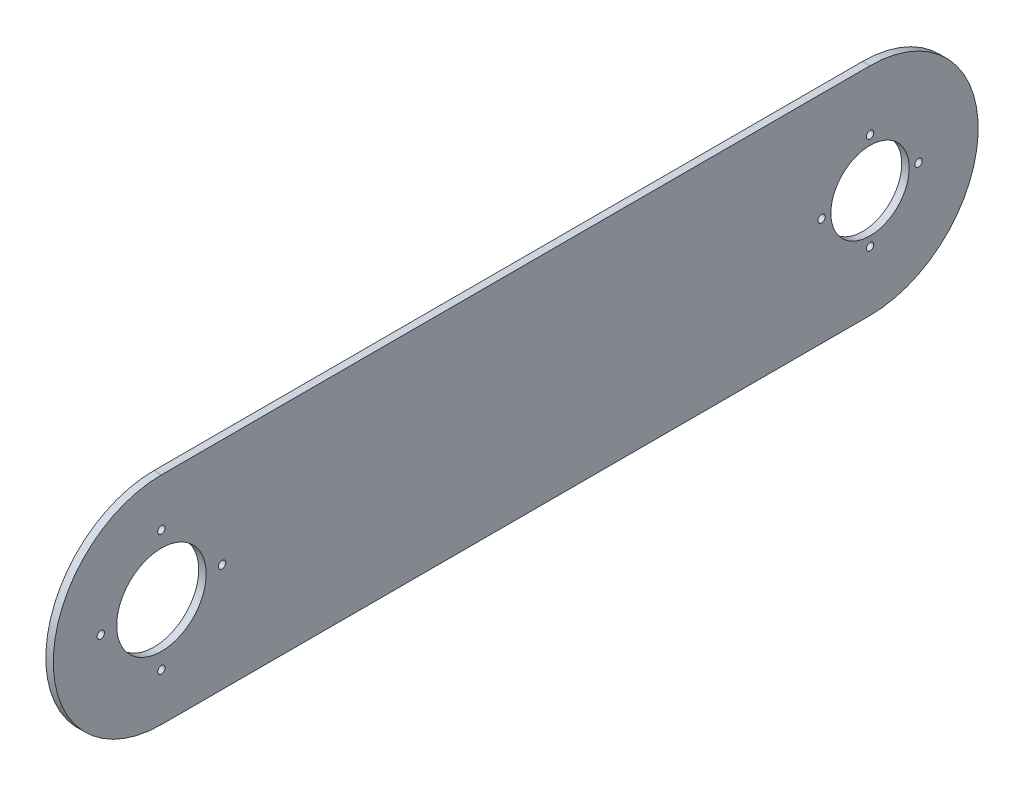
ISO-10303-21;
HEADER;
FILE_DESCRIPTION(('STEP AP214'),'2;1');
FILE_NAME('part.step','',(''),(''),'','','');
FILE_SCHEMA(('AUTOMOTIVE_DESIGN { 1 0 10303 214 1 1 1 1 }'));
ENDSEC;
DATA;
#1=APPLICATION_CONTEXT('core data for automotive mechanical design processes');
#2=APPLICATION_PROTOCOL_DEFINITION('international standard','automotive_design',2000,#1);
#3=PRODUCT_CONTEXT('',#1,'mechanical');
#4=PRODUCT('Part','Part','',(#3));
#5=PRODUCT_RELATED_PRODUCT_CATEGORY('part','',(#4));
#6=PRODUCT_DEFINITION_FORMATION('','',#4);
#7=PRODUCT_DEFINITION_CONTEXT('part definition',#1,'design');
#8=PRODUCT_DEFINITION('design','',#6,#7);
#9=PRODUCT_DEFINITION_SHAPE('','',#8);
#10=(LENGTH_UNIT() NAMED_UNIT(*) SI_UNIT(.MILLI.,.METRE.));
#11=(NAMED_UNIT(*) PLANE_ANGLE_UNIT() SI_UNIT($,.RADIAN.));
#12=(NAMED_UNIT(*) SI_UNIT($,.STERADIAN.) SOLID_ANGLE_UNIT());
#13=UNCERTAINTY_MEASURE_WITH_UNIT(LENGTH_MEASURE(1.E-05),#10,'distance_accuracy_value','');
#14=(GEOMETRIC_REPRESENTATION_CONTEXT(3) GLOBAL_UNCERTAINTY_ASSIGNED_CONTEXT((#13)) GLOBAL_UNIT_ASSIGNED_CONTEXT((#10,
#11,#12)) REPRESENTATION_CONTEXT('',''));
#15=CARTESIAN_POINT('',(0.,0.,0.));
#16=DIRECTION('',(0.,0.,1.));
#17=DIRECTION('',(1.,0.,0.));
#18=AXIS2_PLACEMENT_3D('',#15,#16,#17);
#19=CARTESIAN_POINT('',(4.,0.,0.));
#20=DIRECTION('',(1.,0.,0.));
#21=DIRECTION('',(0.,0.,-1.));
#22=AXIS2_PLACEMENT_3D('',#19,#20,#21);
#23=PLANE('',#22);
#24=CARTESIAN_POINT('',(4.,26.,-380.));
#25=DIRECTION('',(-1.,0.,0.));
#26=DIRECTION('',(0.,0.,1.));
#27=AXIS2_PLACEMENT_3D('',#24,#25,#26);
#28=CIRCLE('',#27,2.);
#29=CARTESIAN_POINT('',(4.,26.,-378.));
#30=VERTEX_POINT('',#29);
#31=EDGE_CURVE('E157',#30,#30,#28,.T.);
#32=ORIENTED_EDGE('',*,*,#31,.T.);
#33=EDGE_LOOP('',(#32));
#34=FACE_BOUND('',#33,.T.);
#35=CARTESIAN_POINT('',(4.,2.77555756156289E-13,-354.));
#36=DIRECTION('',(-1.,0.,0.));
#37=DIRECTION('',(0.,0.,1.));
#38=AXIS2_PLACEMENT_3D('',#35,#36,#37);
#39=CIRCLE('',#38,2.);
#40=CARTESIAN_POINT('',(4.,2.77555756156289E-13,-352.));
#41=VERTEX_POINT('',#40);
#42=EDGE_CURVE('E170',#41,#41,#39,.T.);
#43=ORIENTED_EDGE('',*,*,#42,.T.);
#44=EDGE_LOOP('',(#43));
#45=FACE_BOUND('',#44,.T.);
#46=CARTESIAN_POINT('',(4.,-26.,-379.999999999999));
#47=DIRECTION('',(-1.,0.,0.));
#48=DIRECTION('',(0.,0.,1.));
#49=AXIS2_PLACEMENT_3D('',#46,#47,#48);
#50=CIRCLE('',#49,1.99999999999999);
#51=CARTESIAN_POINT('',(4.,-26.,-377.999999999999));
#52=VERTEX_POINT('',#51);
#53=EDGE_CURVE('E164',#52,#52,#50,.T.);
#54=ORIENTED_EDGE('',*,*,#53,.T.);
#55=EDGE_LOOP('',(#54));
#56=FACE_BOUND('',#55,.T.);
#57=CARTESIAN_POINT('',(4.,-1.11022302462516E-13,-406.));
#58=DIRECTION('',(-1.,0.,0.));
#59=DIRECTION('',(0.,0.,1.));
#60=AXIS2_PLACEMENT_3D('',#57,#58,#59);
#61=CIRCLE('',#60,2.);
#62=CARTESIAN_POINT('',(4.,-1.11022302462516E-13,-404.));
#63=VERTEX_POINT('',#62);
#64=EDGE_CURVE('E158',#63,#63,#61,.T.);
#65=ORIENTED_EDGE('',*,*,#64,.T.);
#66=EDGE_LOOP('',(#65));
#67=FACE_BOUND('',#66,.T.);
#68=CARTESIAN_POINT('',(4.,32.5,0.));
#69=DIRECTION('',(-1.,0.,0.));
#70=DIRECTION('',(0.,0.,1.));
#71=AXIS2_PLACEMENT_3D('',#68,#69,#70);
#72=CIRCLE('',#71,2.);
#73=CARTESIAN_POINT('',(4.,32.5,2.));
#74=VERTEX_POINT('',#73);
#75=EDGE_CURVE('E125',#74,#74,#72,.T.);
#76=ORIENTED_EDGE('',*,*,#75,.T.);
#77=EDGE_LOOP('',(#76));
#78=FACE_BOUND('',#77,.T.);
#79=CARTESIAN_POINT('',(4.,0.,32.5));
#80=DIRECTION('',(-1.,0.,0.));
#81=DIRECTION('',(0.,0.,1.));
#82=AXIS2_PLACEMENT_3D('',#79,#80,#81);
#83=CIRCLE('',#82,2.);
#84=CARTESIAN_POINT('',(4.,0.,34.5));
#85=VERTEX_POINT('',#84);
#86=EDGE_CURVE('E141',#85,#85,#83,.T.);
#87=ORIENTED_EDGE('',*,*,#86,.T.);
#88=EDGE_LOOP('',(#87));
#89=FACE_BOUND('',#88,.T.);
#90=CARTESIAN_POINT('',(4.,-32.5,0.));
#91=DIRECTION('',(-1.,0.,0.));
#92=DIRECTION('',(0.,0.,1.));
#93=AXIS2_PLACEMENT_3D('',#90,#91,#92);
#94=CIRCLE('',#93,2.);
#95=CARTESIAN_POINT('',(4.,-32.5,2.));
#96=VERTEX_POINT('',#95);
#97=EDGE_CURVE('E135',#96,#96,#94,.T.);
#98=ORIENTED_EDGE('',*,*,#97,.T.);
#99=EDGE_LOOP('',(#98));
#100=FACE_BOUND('',#99,.T.);
#101=CARTESIAN_POINT('',(4.,0.,-32.5));
#102=DIRECTION('',(-1.,0.,0.));
#103=DIRECTION('',(0.,0.,1.));
#104=AXIS2_PLACEMENT_3D('',#101,#102,#103);
#105=CIRCLE('',#104,2.);
#106=CARTESIAN_POINT('',(4.,0.,-30.5));
#107=VERTEX_POINT('',#106);
#108=EDGE_CURVE('E128',#107,#107,#105,.T.);
#109=ORIENTED_EDGE('',*,*,#108,.T.);
#110=EDGE_LOOP('',(#109));
#111=FACE_BOUND('',#110,.T.);
#112=CARTESIAN_POINT('',(4.,0.,0.));
#113=DIRECTION('',(1.,0.,0.));
#114=DIRECTION('',(0.,0.,-1.));
#115=AXIS2_PLACEMENT_3D('',#112,#113,#114);
#116=CIRCLE('',#115,24.);
#117=CARTESIAN_POINT('',(4.,0.,-24.));
#118=VERTEX_POINT('',#117);
#119=EDGE_CURVE('E110',#118,#118,#116,.T.);
#120=ORIENTED_EDGE('',*,*,#119,.F.);
#121=EDGE_LOOP('',(#120));
#122=FACE_BOUND('',#121,.T.);
#123=CARTESIAN_POINT('',(4.,0.,0.));
#124=DIRECTION('',(1.,0.,0.));
#125=DIRECTION('',(0.,0.,-1.));
#126=AXIS2_PLACEMENT_3D('',#123,#124,#125);
#127=CIRCLE('',#126,58.);
#128=CARTESIAN_POINT('',(4.,58.,0.));
#129=VERTEX_POINT('',#128);
#130=CARTESIAN_POINT('',(4.,-58.,0.));
#131=VERTEX_POINT('',#130);
#132=EDGE_CURVE('E95',#129,#131,#127,.T.);
#133=ORIENTED_EDGE('',*,*,#132,.T.);
#134=DIRECTION('',(0.,0.,-1.));
#135=VECTOR('',#134,1.);
#136=CARTESIAN_POINT('',(4.,-58.,0.));
#137=LINE('',#136,#135);
#138=CARTESIAN_POINT('',(4.,-58.,-380.));
#139=VERTEX_POINT('',#138);
#140=EDGE_CURVE('E90',#131,#139,#137,.T.);
#141=ORIENTED_EDGE('',*,*,#140,.T.);
#142=CARTESIAN_POINT('',(4.,0.,-380.));
#143=DIRECTION('',(1.,0.,0.));
#144=DIRECTION('',(0.,0.,-1.));
#145=AXIS2_PLACEMENT_3D('',#142,#143,#144);
#146=CIRCLE('',#145,58.);
#147=CARTESIAN_POINT('',(4.,58.,-380.));
#148=VERTEX_POINT('',#147);
#149=EDGE_CURVE('E93',#139,#148,#146,.T.);
#150=ORIENTED_EDGE('',*,*,#149,.T.);
#151=DIRECTION('',(0.,0.,1.));
#152=VECTOR('',#151,1.);
#153=CARTESIAN_POINT('',(4.,58.,0.));
#154=LINE('',#153,#152);
#155=EDGE_CURVE('E60',#148,#129,#154,.T.);
#156=ORIENTED_EDGE('',*,*,#155,.T.);
#157=EDGE_LOOP('',(#133,#141,#150,#156));
#158=FACE_BOUND('',#157,.T.);
#159=CARTESIAN_POINT('',(4.,0.,-380.));
#160=DIRECTION('',(1.,0.,0.));
#161=DIRECTION('',(0.,0.,-1.));
#162=AXIS2_PLACEMENT_3D('',#159,#160,#161);
#163=CIRCLE('',#162,21.);
#164=CARTESIAN_POINT('',(4.,0.,-401.));
#165=VERTEX_POINT('',#164);
#166=EDGE_CURVE('E132',#165,#165,#163,.F.);
#167=ORIENTED_EDGE('',*,*,#166,.T.);
#168=EDGE_LOOP('',(#167));
#169=FACE_BOUND('',#168,.T.);
#170=ADVANCED_FACE('F43',(#34,#45,#56,#67,#78,#89,#100,#111,#122,#158,#169),#23,.T.);
#171=CARTESIAN_POINT('',(0.,0.,0.));
#172=DIRECTION('',(1.,0.,0.));
#173=DIRECTION('',(0.,0.,-1.));
#174=AXIS2_PLACEMENT_3D('',#171,#172,#173);
#175=PLANE('',#174);
#176=CARTESIAN_POINT('',(0.,26.,-380.));
#177=DIRECTION('',(-1.,0.,0.));
#178=DIRECTION('',(0.,0.,1.));
#179=AXIS2_PLACEMENT_3D('',#176,#177,#178);
#180=CIRCLE('',#179,2.);
#181=CARTESIAN_POINT('',(0.,26.,-378.));
#182=VERTEX_POINT('',#181);
#183=EDGE_CURVE('E176',#182,#182,#180,.T.);
#184=ORIENTED_EDGE('',*,*,#183,.F.);
#185=EDGE_LOOP('',(#184));
#186=FACE_BOUND('',#185,.T.);
#187=CARTESIAN_POINT('',(0.,2.77555756156289E-13,-354.));
#188=DIRECTION('',(-1.,0.,0.));
#189=DIRECTION('',(0.,0.,1.));
#190=AXIS2_PLACEMENT_3D('',#187,#188,#189);
#191=CIRCLE('',#190,2.);
#192=CARTESIAN_POINT('',(0.,2.77555756156289E-13,-352.));
#193=VERTEX_POINT('',#192);
#194=EDGE_CURVE('E173',#193,#193,#191,.T.);
#195=ORIENTED_EDGE('',*,*,#194,.F.);
#196=EDGE_LOOP('',(#195));
#197=FACE_BOUND('',#196,.T.);
#198=CARTESIAN_POINT('',(0.,-26.,-379.999999999999));
#199=DIRECTION('',(-1.,0.,0.));
#200=DIRECTION('',(0.,0.,1.));
#201=AXIS2_PLACEMENT_3D('',#198,#199,#200);
#202=CIRCLE('',#201,1.99999999999999);
#203=CARTESIAN_POINT('',(0.,-26.,-377.999999999999));
#204=VERTEX_POINT('',#203);
#205=EDGE_CURVE('E167',#204,#204,#202,.T.);
#206=ORIENTED_EDGE('',*,*,#205,.F.);
#207=EDGE_LOOP('',(#206));
#208=FACE_BOUND('',#207,.T.);
#209=CARTESIAN_POINT('',(0.,-1.11022302462516E-13,-406.));
#210=DIRECTION('',(-1.,0.,0.));
#211=DIRECTION('',(0.,0.,1.));
#212=AXIS2_PLACEMENT_3D('',#209,#210,#211);
#213=CIRCLE('',#212,2.);
#214=CARTESIAN_POINT('',(0.,-1.11022302462516E-13,-404.));
#215=VERTEX_POINT('',#214);
#216=EDGE_CURVE('E161',#215,#215,#213,.T.);
#217=ORIENTED_EDGE('',*,*,#216,.F.);
#218=EDGE_LOOP('',(#217));
#219=FACE_BOUND('',#218,.T.);
#220=CARTESIAN_POINT('',(0.,32.5,0.));
#221=DIRECTION('',(-1.,0.,0.));
#222=DIRECTION('',(0.,0.,1.));
#223=AXIS2_PLACEMENT_3D('',#220,#221,#222);
#224=CIRCLE('',#223,2.);
#225=CARTESIAN_POINT('',(0.,32.5,2.));
#226=VERTEX_POINT('',#225);
#227=EDGE_CURVE('E147',#226,#226,#224,.T.);
#228=ORIENTED_EDGE('',*,*,#227,.F.);
#229=EDGE_LOOP('',(#228));
#230=FACE_BOUND('',#229,.T.);
#231=CARTESIAN_POINT('',(0.,0.,32.5));
#232=DIRECTION('',(-1.,0.,0.));
#233=DIRECTION('',(0.,0.,1.));
#234=AXIS2_PLACEMENT_3D('',#231,#232,#233);
#235=CIRCLE('',#234,2.);
#236=CARTESIAN_POINT('',(0.,0.,34.5));
#237=VERTEX_POINT('',#236);
#238=EDGE_CURVE('E144',#237,#237,#235,.T.);
#239=ORIENTED_EDGE('',*,*,#238,.F.);
#240=EDGE_LOOP('',(#239));
#241=FACE_BOUND('',#240,.T.);
#242=CARTESIAN_POINT('',(0.,-32.5,0.));
#243=DIRECTION('',(-1.,0.,0.));
#244=DIRECTION('',(0.,0.,1.));
#245=AXIS2_PLACEMENT_3D('',#242,#243,#244);
#246=CIRCLE('',#245,2.);
#247=CARTESIAN_POINT('',(0.,-32.5,2.));
#248=VERTEX_POINT('',#247);
#249=EDGE_CURVE('E138',#248,#248,#246,.T.);
#250=ORIENTED_EDGE('',*,*,#249,.F.);
#251=EDGE_LOOP('',(#250));
#252=FACE_BOUND('',#251,.T.);
#253=CARTESIAN_POINT('',(0.,0.,-32.5));
#254=DIRECTION('',(-1.,0.,0.));
#255=DIRECTION('',(0.,0.,1.));
#256=AXIS2_PLACEMENT_3D('',#253,#254,#255);
#257=CIRCLE('',#256,2.);
#258=CARTESIAN_POINT('',(0.,0.,-30.5));
#259=VERTEX_POINT('',#258);
#260=EDGE_CURVE('E131',#259,#259,#257,.T.);
#261=ORIENTED_EDGE('',*,*,#260,.F.);
#262=EDGE_LOOP('',(#261));
#263=FACE_BOUND('',#262,.T.);
#264=CARTESIAN_POINT('',(0.,0.,0.));
#265=DIRECTION('',(1.,0.,0.));
#266=DIRECTION('',(0.,0.,-1.));
#267=AXIS2_PLACEMENT_3D('',#264,#265,#266);
#268=CIRCLE('',#267,58.);
#269=CARTESIAN_POINT('',(0.,58.,0.));
#270=VERTEX_POINT('',#269);
#271=CARTESIAN_POINT('',(0.,-58.,0.));
#272=VERTEX_POINT('',#271);
#273=EDGE_CURVE('E107',#270,#272,#268,.T.);
#274=ORIENTED_EDGE('',*,*,#273,.F.);
#275=DIRECTION('',(0.,0.,1.));
#276=VECTOR('',#275,1.);
#277=CARTESIAN_POINT('',(0.,58.,0.));
#278=LINE('',#277,#276);
#279=CARTESIAN_POINT('',(0.,58.,-380.));
#280=VERTEX_POINT('',#279);
#281=EDGE_CURVE('E83',#280,#270,#278,.T.);
#282=ORIENTED_EDGE('',*,*,#281,.F.);
#283=CARTESIAN_POINT('',(0.,0.,-380.));
#284=DIRECTION('',(1.,0.,0.));
#285=DIRECTION('',(0.,0.,-1.));
#286=AXIS2_PLACEMENT_3D('',#283,#284,#285);
#287=CIRCLE('',#286,58.);
#288=CARTESIAN_POINT('',(0.,-58.,-380.));
#289=VERTEX_POINT('',#288);
#290=EDGE_CURVE('E77',#289,#280,#287,.T.);
#291=ORIENTED_EDGE('',*,*,#290,.F.);
#292=DIRECTION('',(0.,0.,-1.));
#293=VECTOR('',#292,1.);
#294=CARTESIAN_POINT('',(0.,-58.,0.));
#295=LINE('',#294,#293);
#296=EDGE_CURVE('E99',#272,#289,#295,.T.);
#297=ORIENTED_EDGE('',*,*,#296,.F.);
#298=EDGE_LOOP('',(#274,#282,#291,#297));
#299=FACE_BOUND('',#298,.T.);
#300=CARTESIAN_POINT('',(0.,0.,0.));
#301=DIRECTION('',(1.,0.,0.));
#302=DIRECTION('',(0.,0.,-1.));
#303=AXIS2_PLACEMENT_3D('',#300,#301,#302);
#304=CIRCLE('',#303,24.);
#305=CARTESIAN_POINT('',(0.,0.,-24.));
#306=VERTEX_POINT('',#305);
#307=EDGE_CURVE('E122',#306,#306,#304,.T.);
#308=ORIENTED_EDGE('',*,*,#307,.T.);
#309=EDGE_LOOP('',(#308));
#310=FACE_BOUND('',#309,.T.);
#311=CARTESIAN_POINT('',(0.,0.,-380.));
#312=DIRECTION('',(-1.,0.,0.));
#313=DIRECTION('',(0.,0.,1.));
#314=AXIS2_PLACEMENT_3D('',#311,#312,#313);
#315=CIRCLE('',#314,21.);
#316=CARTESIAN_POINT('',(0.,0.,-359.));
#317=VERTEX_POINT('',#316);
#318=EDGE_CURVE('E154',#317,#317,#315,.T.);
#319=ORIENTED_EDGE('',*,*,#318,.F.);
#320=EDGE_LOOP('',(#319));
#321=FACE_BOUND('',#320,.T.);
#322=ADVANCED_FACE('F118',(#186,#197,#208,#219,#230,#241,#252,#263,#299,#310,#321),#175,.F.);
#323=CARTESIAN_POINT('',(4.,0.,0.));
#324=DIRECTION('',(-1.,0.,0.));
#325=DIRECTION('',(0.,0.,1.));
#326=AXIS2_PLACEMENT_3D('',#323,#324,#325);
#327=CYLINDRICAL_SURFACE('',#326,58.);
#328=ORIENTED_EDGE('',*,*,#273,.T.);
#329=DIRECTION('',(-1.,0.,0.));
#330=VECTOR('',#329,1.);
#331=CARTESIAN_POINT('',(4.,-58.,0.));
#332=LINE('',#331,#330);
#333=EDGE_CURVE('E11',#131,#272,#332,.T.);
#334=ORIENTED_EDGE('',*,*,#333,.F.);
#335=ORIENTED_EDGE('',*,*,#132,.F.);
#336=DIRECTION('',(-1.,0.,0.));
#337=VECTOR('',#336,1.);
#338=CARTESIAN_POINT('',(4.,58.,0.));
#339=LINE('',#338,#337);
#340=EDGE_CURVE('E103',#129,#270,#339,.T.);
#341=ORIENTED_EDGE('',*,*,#340,.T.);
#342=EDGE_LOOP('',(#328,#334,#335,#341));
#343=FACE_BOUND('',#342,.T.);
#344=ADVANCED_FACE('F45',(#343),#327,.T.);
#345=CARTESIAN_POINT('',(4.,-58.,0.));
#346=DIRECTION('',(0.,1.,0.));
#347=DIRECTION('',(0.,0.,1.));
#348=AXIS2_PLACEMENT_3D('',#345,#346,#347);
#349=PLANE('',#348);
#350=ORIENTED_EDGE('',*,*,#296,.T.);
#351=DIRECTION('',(-1.,0.,0.));
#352=VECTOR('',#351,1.);
#353=CARTESIAN_POINT('',(4.,-58.,-380.));
#354=LINE('',#353,#352);
#355=EDGE_CURVE('E52',#139,#289,#354,.T.);
#356=ORIENTED_EDGE('',*,*,#355,.F.);
#357=ORIENTED_EDGE('',*,*,#140,.F.);
#358=ORIENTED_EDGE('',*,*,#333,.T.);
#359=EDGE_LOOP('',(#350,#356,#357,#358));
#360=FACE_BOUND('',#359,.T.);
#361=ADVANCED_FACE('F98',(#360),#349,.F.);
#362=CARTESIAN_POINT('',(4.,0.,-380.));
#363=DIRECTION('',(-1.,0.,0.));
#364=DIRECTION('',(0.,0.,1.));
#365=AXIS2_PLACEMENT_3D('',#362,#363,#364);
#366=CYLINDRICAL_SURFACE('',#365,58.);
#367=ORIENTED_EDGE('',*,*,#290,.T.);
#368=DIRECTION('',(-1.,0.,0.));
#369=VECTOR('',#368,1.);
#370=CARTESIAN_POINT('',(4.,58.,-380.));
#371=LINE('',#370,#369);
#372=EDGE_CURVE('E100',#148,#280,#371,.T.);
#373=ORIENTED_EDGE('',*,*,#372,.F.);
#374=ORIENTED_EDGE('',*,*,#149,.F.);
#375=ORIENTED_EDGE('',*,*,#355,.T.);
#376=EDGE_LOOP('',(#367,#373,#374,#375));
#377=FACE_BOUND('',#376,.T.);
#378=ADVANCED_FACE('F101',(#377),#366,.T.);
#379=CARTESIAN_POINT('',(4.,58.,0.));
#380=DIRECTION('',(0.,-1.,0.));
#381=DIRECTION('',(0.,0.,-1.));
#382=AXIS2_PLACEMENT_3D('',#379,#380,#381);
#383=PLANE('',#382);
#384=ORIENTED_EDGE('',*,*,#281,.T.);
#385=ORIENTED_EDGE('',*,*,#340,.F.);
#386=ORIENTED_EDGE('',*,*,#155,.F.);
#387=ORIENTED_EDGE('',*,*,#372,.T.);
#388=EDGE_LOOP('',(#384,#385,#386,#387));
#389=FACE_BOUND('',#388,.T.);
#390=ADVANCED_FACE('F115',(#389),#383,.F.);
#391=CARTESIAN_POINT('',(4.,0.,0.));
#392=DIRECTION('',(-1.,0.,0.));
#393=DIRECTION('',(0.,0.,1.));
#394=AXIS2_PLACEMENT_3D('',#391,#392,#393);
#395=CYLINDRICAL_SURFACE('',#394,24.);
#396=ORIENTED_EDGE('',*,*,#119,.T.);
#397=EDGE_LOOP('',(#396));
#398=FACE_BOUND('',#397,.T.);
#399=ORIENTED_EDGE('',*,*,#307,.F.);
#400=EDGE_LOOP('',(#399));
#401=FACE_BOUND('',#400,.T.);
#402=ADVANCED_FACE('F211',(#398,#401),#395,.F.);
#403=CARTESIAN_POINT('',(4.,0.,-32.5));
#404=DIRECTION('',(-1.,0.,0.));
#405=DIRECTION('',(0.,0.,1.));
#406=AXIS2_PLACEMENT_3D('',#403,#404,#405);
#407=CYLINDRICAL_SURFACE('',#406,2.);
#408=ORIENTED_EDGE('',*,*,#108,.F.);
#409=EDGE_LOOP('',(#408));
#410=FACE_BOUND('',#409,.T.);
#411=ORIENTED_EDGE('',*,*,#260,.T.);
#412=EDGE_LOOP('',(#411));
#413=FACE_BOUND('',#412,.T.);
#414=ADVANCED_FACE('F208',(#410,#413),#407,.F.);
#415=CARTESIAN_POINT('',(4.,-32.5,0.));
#416=DIRECTION('',(-1.,0.,0.));
#417=DIRECTION('',(0.,0.,1.));
#418=AXIS2_PLACEMENT_3D('',#415,#416,#417);
#419=CYLINDRICAL_SURFACE('',#418,2.);
#420=ORIENTED_EDGE('',*,*,#97,.F.);
#421=EDGE_LOOP('',(#420));
#422=FACE_BOUND('',#421,.T.);
#423=ORIENTED_EDGE('',*,*,#249,.T.);
#424=EDGE_LOOP('',(#423));
#425=FACE_BOUND('',#424,.T.);
#426=ADVANCED_FACE('F210',(#422,#425),#419,.F.);
#427=CARTESIAN_POINT('',(4.,0.,32.5));
#428=DIRECTION('',(-1.,0.,0.));
#429=DIRECTION('',(0.,0.,1.));
#430=AXIS2_PLACEMENT_3D('',#427,#428,#429);
#431=CYLINDRICAL_SURFACE('',#430,2.);
#432=ORIENTED_EDGE('',*,*,#86,.F.);
#433=EDGE_LOOP('',(#432));
#434=FACE_BOUND('',#433,.T.);
#435=ORIENTED_EDGE('',*,*,#238,.T.);
#436=EDGE_LOOP('',(#435));
#437=FACE_BOUND('',#436,.T.);
#438=ADVANCED_FACE('F218',(#434,#437),#431,.F.);
#439=CARTESIAN_POINT('',(4.,32.5,0.));
#440=DIRECTION('',(-1.,0.,0.));
#441=DIRECTION('',(0.,0.,1.));
#442=AXIS2_PLACEMENT_3D('',#439,#440,#441);
#443=CYLINDRICAL_SURFACE('',#442,2.);
#444=ORIENTED_EDGE('',*,*,#75,.F.);
#445=EDGE_LOOP('',(#444));
#446=FACE_BOUND('',#445,.T.);
#447=ORIENTED_EDGE('',*,*,#227,.T.);
#448=EDGE_LOOP('',(#447));
#449=FACE_BOUND('',#448,.T.);
#450=ADVANCED_FACE('F287',(#446,#449),#443,.F.);
#451=CARTESIAN_POINT('',(71.8822509939086,0.,-380.));
#452=DIRECTION('',(-1.,0.,0.));
#453=DIRECTION('',(0.,0.,1.));
#454=AXIS2_PLACEMENT_3D('',#451,#452,#453);
#455=CYLINDRICAL_SURFACE('',#454,21.);
#456=ORIENTED_EDGE('',*,*,#318,.T.);
#457=EDGE_LOOP('',(#456));
#458=FACE_BOUND('',#457,.T.);
#459=ORIENTED_EDGE('',*,*,#166,.F.);
#460=EDGE_LOOP('',(#459));
#461=FACE_BOUND('',#460,.T.);
#462=ADVANCED_FACE('F296',(#458,#461),#455,.F.);
#463=CARTESIAN_POINT('',(4.,-1.11022302462516E-13,-406.));
#464=DIRECTION('',(-1.,0.,0.));
#465=DIRECTION('',(0.,0.,1.));
#466=AXIS2_PLACEMENT_3D('',#463,#464,#465);
#467=CYLINDRICAL_SURFACE('',#466,2.);
#468=ORIENTED_EDGE('',*,*,#64,.F.);
#469=EDGE_LOOP('',(#468));
#470=FACE_BOUND('',#469,.T.);
#471=ORIENTED_EDGE('',*,*,#216,.T.);
#472=EDGE_LOOP('',(#471));
#473=FACE_BOUND('',#472,.T.);
#474=ADVANCED_FACE('F315',(#470,#473),#467,.F.);
#475=CARTESIAN_POINT('',(4.,-26.,-379.999999999999));
#476=DIRECTION('',(-1.,0.,0.));
#477=DIRECTION('',(0.,0.,1.));
#478=AXIS2_PLACEMENT_3D('',#475,#476,#477);
#479=CYLINDRICAL_SURFACE('',#478,1.99999999999999);
#480=ORIENTED_EDGE('',*,*,#53,.F.);
#481=EDGE_LOOP('',(#480));
#482=FACE_BOUND('',#481,.T.);
#483=ORIENTED_EDGE('',*,*,#205,.T.);
#484=EDGE_LOOP('',(#483));
#485=FACE_BOUND('',#484,.T.);
#486=ADVANCED_FACE('F324',(#482,#485),#479,.F.);
#487=CARTESIAN_POINT('',(4.,2.77555756156289E-13,-354.));
#488=DIRECTION('',(-1.,0.,0.));
#489=DIRECTION('',(0.,0.,1.));
#490=AXIS2_PLACEMENT_3D('',#487,#488,#489);
#491=CYLINDRICAL_SURFACE('',#490,2.);
#492=ORIENTED_EDGE('',*,*,#42,.F.);
#493=EDGE_LOOP('',(#492));
#494=FACE_BOUND('',#493,.T.);
#495=ORIENTED_EDGE('',*,*,#194,.T.);
#496=EDGE_LOOP('',(#495));
#497=FACE_BOUND('',#496,.T.);
#498=ADVANCED_FACE('F187',(#494,#497),#491,.F.);
#499=CARTESIAN_POINT('',(4.,26.,-380.));
#500=DIRECTION('',(-1.,0.,0.));
#501=DIRECTION('',(0.,0.,1.));
#502=AXIS2_PLACEMENT_3D('',#499,#500,#501);
#503=CYLINDRICAL_SURFACE('',#502,2.);
#504=ORIENTED_EDGE('',*,*,#31,.F.);
#505=EDGE_LOOP('',(#504));
#506=FACE_BOUND('',#505,.T.);
#507=ORIENTED_EDGE('',*,*,#183,.T.);
#508=EDGE_LOOP('',(#507));
#509=FACE_BOUND('',#508,.T.);
#510=ADVANCED_FACE('F184',(#506,#509),#503,.F.);
#511=CLOSED_SHELL('',(#170,#322,#344,#361,#378,#390,#402,#414,#426,#438,#450,#462,#474,#486,
#498,#510));
#512=MANIFOLD_SOLID_BREP('B2',#511);
#513=ADVANCED_BREP_SHAPE_REPRESENTATION('',(#18,#512),#14);
#514=SHAPE_DEFINITION_REPRESENTATION(#9,#513);
ENDSEC;
END-ISO-10303-21;
